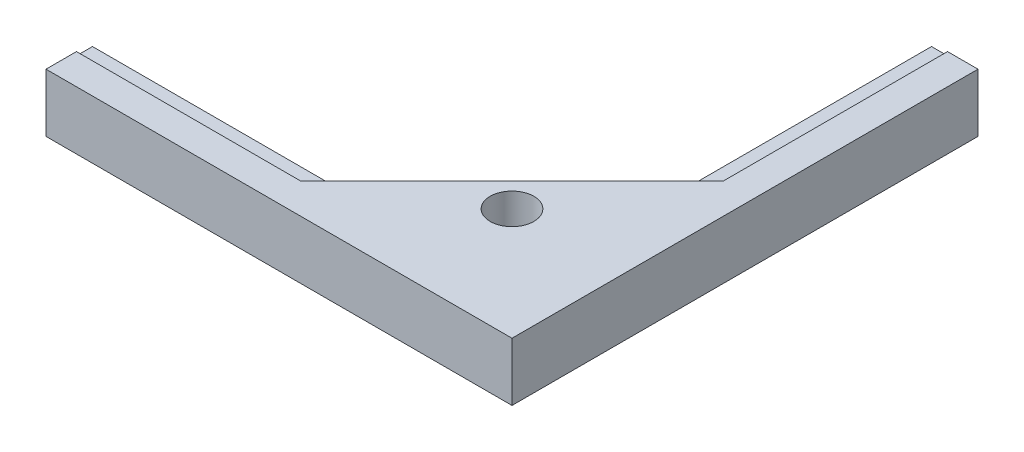
ISO-10303-21;
HEADER;
FILE_DESCRIPTION(('STEP AP214'),'2;1');
FILE_NAME('part.step','',(''),(''),'','','');
FILE_SCHEMA(('AUTOMOTIVE_DESIGN { 1 0 10303 214 1 1 1 1 }'));
ENDSEC;
DATA;
#1=APPLICATION_CONTEXT('core data for automotive mechanical design processes');
#2=APPLICATION_PROTOCOL_DEFINITION('international standard','automotive_design',2000,#1);
#3=PRODUCT_CONTEXT('',#1,'mechanical');
#4=PRODUCT('Part','Part','',(#3));
#5=PRODUCT_RELATED_PRODUCT_CATEGORY('part','',(#4));
#6=PRODUCT_DEFINITION_FORMATION('','',#4);
#7=PRODUCT_DEFINITION_CONTEXT('part definition',#1,'design');
#8=PRODUCT_DEFINITION('design','',#6,#7);
#9=PRODUCT_DEFINITION_SHAPE('','',#8);
#10=(LENGTH_UNIT() NAMED_UNIT(*) SI_UNIT(.MILLI.,.METRE.));
#11=(NAMED_UNIT(*) PLANE_ANGLE_UNIT() SI_UNIT($,.RADIAN.));
#12=(NAMED_UNIT(*) SI_UNIT($,.STERADIAN.) SOLID_ANGLE_UNIT());
#13=UNCERTAINTY_MEASURE_WITH_UNIT(LENGTH_MEASURE(1.E-05),#10,'distance_accuracy_value','');
#14=(GEOMETRIC_REPRESENTATION_CONTEXT(3) GLOBAL_UNCERTAINTY_ASSIGNED_CONTEXT((#13)) GLOBAL_UNIT_ASSIGNED_CONTEXT((#10,
#11,#12)) REPRESENTATION_CONTEXT('',''));
#15=CARTESIAN_POINT('',(0.,0.,0.));
#16=DIRECTION('',(0.,0.,1.));
#17=DIRECTION('',(1.,0.,0.));
#18=AXIS2_PLACEMENT_3D('',#15,#16,#17);
#19=CARTESIAN_POINT('',(-33.1850965905711,8.,-4.18509659057105));
#20=DIRECTION('',(0.,0.,1.));
#21=DIRECTION('',(1.,0.,0.));
#22=AXIS2_PLACEMENT_3D('',#19,#20,#21);
#23=PLANE('',#22);
#24=DIRECTION('',(-1.,0.,0.));
#25=VECTOR('',#24,1.);
#26=CARTESIAN_POINT('',(-33.1850965905711,7.5,-4.18509659057105));
#27=LINE('',#26,#25);
#28=CARTESIAN_POINT('',(-33.1850965905711,7.5,-4.18509659057105));
#29=VERTEX_POINT('',#28);
#30=CARTESIAN_POINT('',(-64.,7.5,-4.18509659057116));
#31=VERTEX_POINT('',#30);
#32=EDGE_CURVE('E149',#29,#31,#27,.T.);
#33=ORIENTED_EDGE('',*,*,#32,.T.);
#34=DIRECTION('',(0.,-1.,0.));
#35=VECTOR('',#34,1.);
#36=CARTESIAN_POINT('',(-64.,8.,-4.18509659057116));
#37=LINE('',#36,#35);
#38=CARTESIAN_POINT('',(-64.,8.,-4.18509659057116));
#39=VERTEX_POINT('',#38);
#40=EDGE_CURVE('E180',#39,#31,#37,.T.);
#41=ORIENTED_EDGE('',*,*,#40,.F.);
#42=DIRECTION('',(-1.,0.,0.));
#43=VECTOR('',#42,1.);
#44=CARTESIAN_POINT('',(-33.1850965905711,8.,-4.18509659057105));
#45=LINE('',#44,#43);
#46=CARTESIAN_POINT('',(-33.1850965905711,8.,-4.18509659057105));
#47=VERTEX_POINT('',#46);
#48=EDGE_CURVE('E174',#47,#39,#45,.T.);
#49=ORIENTED_EDGE('',*,*,#48,.F.);
#50=DIRECTION('',(0.,-1.,0.));
#51=VECTOR('',#50,1.);
#52=CARTESIAN_POINT('',(-33.1850965905711,8.,-4.18509659057105));
#53=LINE('',#52,#51);
#54=EDGE_CURVE('E167',#47,#29,#53,.T.);
#55=ORIENTED_EDGE('',*,*,#54,.T.);
#56=EDGE_LOOP('',(#33,#41,#49,#55));
#57=FACE_BOUND('',#56,.T.);
#58=ADVANCED_FACE('F41',(#57),#23,.F.);
#59=CARTESIAN_POINT('',(-4.18509659057107,8.,-64.));
#60=DIRECTION('',(1.,0.,0.));
#61=DIRECTION('',(0.,0.,-1.));
#62=AXIS2_PLACEMENT_3D('',#59,#60,#61);
#63=PLANE('',#62);
#64=DIRECTION('',(0.,0.,1.));
#65=VECTOR('',#64,1.);
#66=CARTESIAN_POINT('',(-4.18509659057107,7.5,-64.));
#67=LINE('',#66,#65);
#68=CARTESIAN_POINT('',(-4.18509659057107,7.5,-64.));
#69=VERTEX_POINT('',#68);
#70=CARTESIAN_POINT('',(-4.18509659057106,7.5,-33.1850965905712));
#71=VERTEX_POINT('',#70);
#72=EDGE_CURVE('E262',#69,#71,#67,.T.);
#73=ORIENTED_EDGE('',*,*,#72,.T.);
#74=DIRECTION('',(0.,-1.,0.));
#75=VECTOR('',#74,1.);
#76=CARTESIAN_POINT('',(-4.18509659057106,8.,-33.1850965905712));
#77=LINE('',#76,#75);
#78=CARTESIAN_POINT('',(-4.18509659057106,8.,-33.1850965905712));
#79=VERTEX_POINT('',#78);
#80=EDGE_CURVE('E178',#79,#71,#77,.T.);
#81=ORIENTED_EDGE('',*,*,#80,.F.);
#82=DIRECTION('',(0.,0.,1.));
#83=VECTOR('',#82,1.);
#84=CARTESIAN_POINT('',(-4.18509659057107,8.,-64.));
#85=LINE('',#84,#83);
#86=CARTESIAN_POINT('',(-4.18509659057107,8.,-64.));
#87=VERTEX_POINT('',#86);
#88=EDGE_CURVE('E252',#87,#79,#85,.T.);
#89=ORIENTED_EDGE('',*,*,#88,.F.);
#90=DIRECTION('',(0.,-1.,0.));
#91=VECTOR('',#90,1.);
#92=CARTESIAN_POINT('',(-4.18509659057107,8.,-64.));
#93=LINE('',#92,#91);
#94=EDGE_CURVE('E185',#87,#69,#93,.T.);
#95=ORIENTED_EDGE('',*,*,#94,.T.);
#96=EDGE_LOOP('',(#73,#81,#89,#95));
#97=FACE_BOUND('',#96,.T.);
#98=ADVANCED_FACE('F263',(#97),#63,.F.);
#99=CARTESIAN_POINT('',(0.,8.,0.));
#100=DIRECTION('',(0.,1.,0.));
#101=DIRECTION('',(0.,0.,1.));
#102=AXIS2_PLACEMENT_3D('',#99,#100,#101);
#103=PLANE('',#102);
#104=DIRECTION('',(1.,0.,0.));
#105=VECTOR('',#104,1.);
#106=CARTESIAN_POINT('',(-64.,8.,0.));
#107=LINE('',#106,#105);
#108=CARTESIAN_POINT('',(-64.,8.,0.));
#109=VERTEX_POINT('',#108);
#110=CARTESIAN_POINT('',(0.,8.,0.));
#111=VERTEX_POINT('',#110);
#112=EDGE_CURVE('E219',#109,#111,#107,.T.);
#113=ORIENTED_EDGE('',*,*,#112,.T.);
#114=DIRECTION('',(0.,0.,-1.));
#115=VECTOR('',#114,1.);
#116=CARTESIAN_POINT('',(0.,8.,0.));
#117=LINE('',#116,#115);
#118=CARTESIAN_POINT('',(0.,8.,-64.));
#119=VERTEX_POINT('',#118);
#120=EDGE_CURVE('E249',#111,#119,#117,.T.);
#121=ORIENTED_EDGE('',*,*,#120,.T.);
#122=DIRECTION('',(-1.,0.,0.));
#123=VECTOR('',#122,1.);
#124=CARTESIAN_POINT('',(0.,8.,-64.));
#125=LINE('',#124,#123);
#126=EDGE_CURVE('E196',#119,#87,#125,.T.);
#127=ORIENTED_EDGE('',*,*,#126,.T.);
#128=ORIENTED_EDGE('',*,*,#88,.T.);
#129=DIRECTION('',(-0.707106781186546,0.,0.707106781186549));
#130=VECTOR('',#129,1.);
#131=CARTESIAN_POINT('',(-4.18509659057106,8.,-33.1850965905712));
#132=LINE('',#131,#130);
#133=EDGE_CURVE('E232',#79,#47,#132,.T.);
#134=ORIENTED_EDGE('',*,*,#133,.T.);
#135=ORIENTED_EDGE('',*,*,#48,.T.);
#136=DIRECTION('',(0.,0.,1.));
#137=VECTOR('',#136,1.);
#138=CARTESIAN_POINT('',(-64.,8.,-4.18509659057116));
#139=LINE('',#138,#137);
#140=EDGE_CURVE('E223',#39,#109,#139,.T.);
#141=ORIENTED_EDGE('',*,*,#140,.T.);
#142=EDGE_LOOP('',(#113,#121,#127,#128,#134,#135,#141));
#143=FACE_BOUND('',#142,.T.);
#144=CARTESIAN_POINT('',(-15.3850965905711,8.,-15.3850965905711));
#145=DIRECTION('',(0.,1.,0.));
#146=DIRECTION('',(0.,0.,1.));
#147=AXIS2_PLACEMENT_3D('',#144,#145,#146);
#148=CIRCLE('',#147,3.);
#149=CARTESIAN_POINT('',(-15.3850965905711,8.,-12.3850965905711));
#150=VERTEX_POINT('',#149);
#151=EDGE_CURVE('E235',#150,#150,#148,.T.);
#152=ORIENTED_EDGE('',*,*,#151,.F.);
#153=EDGE_LOOP('',(#152));
#154=FACE_BOUND('',#153,.T.);
#155=ADVANCED_FACE('F253',(#143,#154),#103,.T.);
#156=CARTESIAN_POINT('',(0.,0.,0.));
#157=DIRECTION('',(0.,1.,0.));
#158=DIRECTION('',(0.,0.,1.));
#159=AXIS2_PLACEMENT_3D('',#156,#157,#158);
#160=PLANE('',#159);
#161=DIRECTION('',(1.,0.,0.));
#162=VECTOR('',#161,1.);
#163=CARTESIAN_POINT('',(-64.,0.,0.));
#164=LINE('',#163,#162);
#165=CARTESIAN_POINT('',(-64.,0.,0.));
#166=VERTEX_POINT('',#165);
#167=CARTESIAN_POINT('',(0.,0.,0.));
#168=VERTEX_POINT('',#167);
#169=EDGE_CURVE('E209',#166,#168,#164,.T.);
#170=ORIENTED_EDGE('',*,*,#169,.F.);
#171=DIRECTION('',(0.,0.,1.));
#172=VECTOR('',#171,1.);
#173=CARTESIAN_POINT('',(-64.,0.,-4.18509659057116));
#174=LINE('',#173,#172);
#175=CARTESIAN_POINT('',(-64.,0.,-4.18509659057116));
#176=VERTEX_POINT('',#175);
#177=EDGE_CURVE('E218',#176,#166,#174,.T.);
#178=ORIENTED_EDGE('',*,*,#177,.F.);
#179=DIRECTION('',(-1.,0.,0.));
#180=VECTOR('',#179,1.);
#181=CARTESIAN_POINT('',(-33.1850965905711,0.,-4.18509659057105));
#182=LINE('',#181,#180);
#183=CARTESIAN_POINT('',(-33.1850965905711,0.,-4.18509659057105));
#184=VERTEX_POINT('',#183);
#185=EDGE_CURVE('E215',#184,#176,#182,.T.);
#186=ORIENTED_EDGE('',*,*,#185,.F.);
#187=DIRECTION('',(-0.707106781186546,0.,0.707106781186549));
#188=VECTOR('',#187,1.);
#189=CARTESIAN_POINT('',(-4.18509659057106,0.,-33.1850965905712));
#190=LINE('',#189,#188);
#191=CARTESIAN_POINT('',(-4.18509659057106,0.,-33.1850965905712));
#192=VERTEX_POINT('',#191);
#193=EDGE_CURVE('E207',#192,#184,#190,.T.);
#194=ORIENTED_EDGE('',*,*,#193,.F.);
#195=DIRECTION('',(0.,0.,1.));
#196=VECTOR('',#195,1.);
#197=CARTESIAN_POINT('',(-4.18509659057107,0.,-64.));
#198=LINE('',#197,#196);
#199=CARTESIAN_POINT('',(-4.18509659057107,0.,-64.));
#200=VERTEX_POINT('',#199);
#201=EDGE_CURVE('E205',#200,#192,#198,.T.);
#202=ORIENTED_EDGE('',*,*,#201,.F.);
#203=DIRECTION('',(-1.,0.,0.));
#204=VECTOR('',#203,1.);
#205=CARTESIAN_POINT('',(0.,0.,-64.));
#206=LINE('',#205,#204);
#207=CARTESIAN_POINT('',(0.,0.,-64.));
#208=VERTEX_POINT('',#207);
#209=EDGE_CURVE('E193',#208,#200,#206,.T.);
#210=ORIENTED_EDGE('',*,*,#209,.F.);
#211=DIRECTION('',(0.,0.,-1.));
#212=VECTOR('',#211,1.);
#213=CARTESIAN_POINT('',(0.,0.,0.));
#214=LINE('',#213,#212);
#215=EDGE_CURVE('E202',#168,#208,#214,.T.);
#216=ORIENTED_EDGE('',*,*,#215,.F.);
#217=EDGE_LOOP('',(#170,#178,#186,#194,#202,#210,#216));
#218=FACE_BOUND('',#217,.T.);
#219=CARTESIAN_POINT('',(-15.3850965905711,0.,-15.3850965905711));
#220=DIRECTION('',(0.,1.,0.));
#221=DIRECTION('',(0.,0.,1.));
#222=AXIS2_PLACEMENT_3D('',#219,#220,#221);
#223=CIRCLE('',#222,3.);
#224=CARTESIAN_POINT('',(-15.3850965905711,0.,-12.3850965905711));
#225=VERTEX_POINT('',#224);
#226=EDGE_CURVE('E238',#225,#225,#223,.T.);
#227=ORIENTED_EDGE('',*,*,#226,.T.);
#228=EDGE_LOOP('',(#227));
#229=FACE_BOUND('',#228,.T.);
#230=ADVANCED_FACE('F200',(#218,#229),#160,.F.);
#231=CARTESIAN_POINT('',(-64.,8.,0.));
#232=DIRECTION('',(0.,0.,-1.));
#233=DIRECTION('',(-1.,0.,0.));
#234=AXIS2_PLACEMENT_3D('',#231,#232,#233);
#235=PLANE('',#234);
#236=ORIENTED_EDGE('',*,*,#169,.T.);
#237=DIRECTION('',(0.,-1.,0.));
#238=VECTOR('',#237,1.);
#239=CARTESIAN_POINT('',(0.,8.,0.));
#240=LINE('',#239,#238);
#241=EDGE_CURVE('E11',#111,#168,#240,.T.);
#242=ORIENTED_EDGE('',*,*,#241,.F.);
#243=ORIENTED_EDGE('',*,*,#112,.F.);
#244=DIRECTION('',(0.,-1.,0.));
#245=VECTOR('',#244,1.);
#246=CARTESIAN_POINT('',(-64.,8.,0.));
#247=LINE('',#246,#245);
#248=EDGE_CURVE('E220',#109,#166,#247,.T.);
#249=ORIENTED_EDGE('',*,*,#248,.T.);
#250=EDGE_LOOP('',(#236,#242,#243,#249));
#251=FACE_BOUND('',#250,.T.);
#252=ADVANCED_FACE('F43',(#251),#235,.F.);
#253=CARTESIAN_POINT('',(0.,8.,0.));
#254=DIRECTION('',(-1.,0.,0.));
#255=DIRECTION('',(0.,0.,1.));
#256=AXIS2_PLACEMENT_3D('',#253,#254,#255);
#257=PLANE('',#256);
#258=ORIENTED_EDGE('',*,*,#215,.T.);
#259=DIRECTION('',(0.,-1.,0.));
#260=VECTOR('',#259,1.);
#261=CARTESIAN_POINT('',(0.,8.,-64.));
#262=LINE('',#261,#260);
#263=EDGE_CURVE('E49',#119,#208,#262,.T.);
#264=ORIENTED_EDGE('',*,*,#263,.F.);
#265=ORIENTED_EDGE('',*,*,#120,.F.);
#266=ORIENTED_EDGE('',*,*,#241,.T.);
#267=EDGE_LOOP('',(#258,#264,#265,#266));
#268=FACE_BOUND('',#267,.T.);
#269=ADVANCED_FACE('F310',(#268),#257,.F.);
#270=CARTESIAN_POINT('',(0.,8.,-64.));
#271=DIRECTION('',(0.,0.,1.));
#272=DIRECTION('',(1.,0.,0.));
#273=AXIS2_PLACEMENT_3D('',#270,#271,#272);
#274=PLANE('',#273);
#275=ORIENTED_EDGE('',*,*,#209,.T.);
#276=CARTESIAN_POINT('',(-4.18509659057107,0.5,-64.));
#277=VERTEX_POINT('',#276);
#278=EDGE_CURVE('E184',#277,#200,#93,.T.);
#279=ORIENTED_EDGE('',*,*,#278,.F.);
#280=DIRECTION('',(1.,0.,0.));
#281=VECTOR('',#280,1.);
#282=CARTESIAN_POINT('',(-6.38509659057107,0.5,-64.));
#283=LINE('',#282,#281);
#284=CARTESIAN_POINT('',(-6.38509659057107,0.5,-64.));
#285=VERTEX_POINT('',#284);
#286=EDGE_CURVE('E282',#285,#277,#283,.T.);
#287=ORIENTED_EDGE('',*,*,#286,.F.);
#288=DIRECTION('',(0.,1.,0.));
#289=VECTOR('',#288,1.);
#290=CARTESIAN_POINT('',(-6.38509659057107,0.5,-64.));
#291=LINE('',#290,#289);
#292=CARTESIAN_POINT('',(-6.38509659057107,7.5,-64.));
#293=VERTEX_POINT('',#292);
#294=EDGE_CURVE('E278',#285,#293,#291,.T.);
#295=ORIENTED_EDGE('',*,*,#294,.T.);
#296=DIRECTION('',(1.,0.,0.));
#297=VECTOR('',#296,1.);
#298=CARTESIAN_POINT('',(-6.38509659057107,7.5,-64.));
#299=LINE('',#298,#297);
#300=EDGE_CURVE('E268',#293,#69,#299,.T.);
#301=ORIENTED_EDGE('',*,*,#300,.T.);
#302=ORIENTED_EDGE('',*,*,#94,.F.);
#303=ORIENTED_EDGE('',*,*,#126,.F.);
#304=ORIENTED_EDGE('',*,*,#263,.T.);
#305=EDGE_LOOP('',(#275,#279,#287,#295,#301,#302,#303,#304));
#306=FACE_BOUND('',#305,.T.);
#307=ADVANCED_FACE('F192',(#306),#274,.F.);
#308=CARTESIAN_POINT('',(-4.18509659057106,0.5,-33.1850965905712));
#309=VERTEX_POINT('',#308);
#310=EDGE_CURVE('E175',#309,#192,#77,.T.);
#311=ORIENTED_EDGE('',*,*,#310,.F.);
#312=DIRECTION('',(0.,0.,1.));
#313=VECTOR('',#312,1.);
#314=CARTESIAN_POINT('',(-4.18509659057107,0.5,-64.));
#315=LINE('',#314,#313);
#316=EDGE_CURVE('E64',#277,#309,#315,.T.);
#317=ORIENTED_EDGE('',*,*,#316,.F.);
#318=ORIENTED_EDGE('',*,*,#278,.T.);
#319=ORIENTED_EDGE('',*,*,#201,.T.);
#320=EDGE_LOOP('',(#311,#317,#318,#319));
#321=FACE_BOUND('',#320,.T.);
#322=ADVANCED_FACE('F317',(#321),#63,.F.);
#323=CARTESIAN_POINT('',(-4.18509659057106,8.,-33.1850965905712));
#324=DIRECTION('',(0.707106781186549,0.,0.707106781186546));
#325=DIRECTION('',(0.707106781186546,0.,-0.707106781186549));
#326=AXIS2_PLACEMENT_3D('',#323,#324,#325);
#327=PLANE('',#326);
#328=CARTESIAN_POINT('',(-33.1850965905711,0.5,-4.18509659057105));
#329=VERTEX_POINT('',#328);
#330=EDGE_CURVE('E176',#329,#184,#53,.T.);
#331=ORIENTED_EDGE('',*,*,#330,.F.);
#332=DIRECTION('',(-0.707106781186527,0.,0.707106781186567));
#333=VECTOR('',#332,1.);
#334=CARTESIAN_POINT('',(-30.9850965905711,0.5,-6.38509659057116));
#335=LINE('',#334,#333);
#336=CARTESIAN_POINT('',(-30.9850965905711,0.5,-6.38509659057116));
#337=VERTEX_POINT('',#336);
#338=EDGE_CURVE('E295',#337,#329,#335,.T.);
#339=ORIENTED_EDGE('',*,*,#338,.F.);
#340=DIRECTION('',(0.,1.,0.));
#341=VECTOR('',#340,1.);
#342=CARTESIAN_POINT('',(-30.9850965905711,0.5,-6.38509659057116));
#343=LINE('',#342,#341);
#344=CARTESIAN_POINT('',(-30.9850965905711,7.5,-6.38509659057116));
#345=VERTEX_POINT('',#344);
#346=EDGE_CURVE('E171',#337,#345,#343,.T.);
#347=ORIENTED_EDGE('',*,*,#346,.T.);
#348=DIRECTION('',(-0.707106781186527,0.,0.707106781186567));
#349=VECTOR('',#348,1.);
#350=CARTESIAN_POINT('',(-30.9850965905711,7.5,-6.38509659057116));
#351=LINE('',#350,#349);
#352=EDGE_CURVE('E153',#345,#29,#351,.T.);
#353=ORIENTED_EDGE('',*,*,#352,.T.);
#354=ORIENTED_EDGE('',*,*,#54,.F.);
#355=ORIENTED_EDGE('',*,*,#133,.F.);
#356=ORIENTED_EDGE('',*,*,#80,.T.);
#357=DIRECTION('',(-0.707106781186547,0.,0.707106781186548));
#358=VECTOR('',#357,1.);
#359=CARTESIAN_POINT('',(-4.18509659057106,7.5,-33.1850965905712));
#360=LINE('',#359,#358);
#361=CARTESIAN_POINT('',(-6.38509659057107,7.5,-30.9850965905712));
#362=VERTEX_POINT('',#361);
#363=EDGE_CURVE('E160',#71,#362,#360,.T.);
#364=ORIENTED_EDGE('',*,*,#363,.T.);
#365=DIRECTION('',(0.,1.,0.));
#366=VECTOR('',#365,1.);
#367=CARTESIAN_POINT('',(-6.38509659057107,0.5,-30.9850965905712));
#368=LINE('',#367,#366);
#369=CARTESIAN_POINT('',(-6.38509659057107,0.5,-30.9850965905712));
#370=VERTEX_POINT('',#369);
#371=EDGE_CURVE('E243',#370,#362,#368,.T.);
#372=ORIENTED_EDGE('',*,*,#371,.F.);
#373=DIRECTION('',(-0.707106781186547,0.,0.707106781186548));
#374=VECTOR('',#373,1.);
#375=CARTESIAN_POINT('',(-4.18509659057106,0.5,-33.1850965905712));
#376=LINE('',#375,#374);
#377=EDGE_CURVE('E267',#309,#370,#376,.T.);
#378=ORIENTED_EDGE('',*,*,#377,.F.);
#379=ORIENTED_EDGE('',*,*,#310,.T.);
#380=ORIENTED_EDGE('',*,*,#193,.T.);
#381=EDGE_LOOP('',(#331,#339,#347,#353,#354,#355,#356,#364,#372,#378,#379,#380));
#382=FACE_BOUND('',#381,.T.);
#383=ADVANCED_FACE('F165',(#382),#327,.F.);
#384=CARTESIAN_POINT('',(-64.,0.5,-4.18509659057116));
#385=VERTEX_POINT('',#384);
#386=EDGE_CURVE('E222',#385,#176,#37,.T.);
#387=ORIENTED_EDGE('',*,*,#386,.F.);
#388=DIRECTION('',(-1.,0.,0.));
#389=VECTOR('',#388,1.);
#390=CARTESIAN_POINT('',(-33.1850965905711,0.5,-4.18509659057105));
#391=LINE('',#390,#389);
#392=EDGE_CURVE('E56',#329,#385,#391,.T.);
#393=ORIENTED_EDGE('',*,*,#392,.F.);
#394=ORIENTED_EDGE('',*,*,#330,.T.);
#395=ORIENTED_EDGE('',*,*,#185,.T.);
#396=EDGE_LOOP('',(#387,#393,#394,#395));
#397=FACE_BOUND('',#396,.T.);
#398=ADVANCED_FACE('F321',(#397),#23,.F.);
#399=CARTESIAN_POINT('',(-64.,8.,-4.18509659057116));
#400=DIRECTION('',(1.,0.,0.));
#401=DIRECTION('',(0.,0.,-1.));
#402=AXIS2_PLACEMENT_3D('',#399,#400,#401);
#403=PLANE('',#402);
#404=ORIENTED_EDGE('',*,*,#177,.T.);
#405=ORIENTED_EDGE('',*,*,#248,.F.);
#406=ORIENTED_EDGE('',*,*,#140,.F.);
#407=ORIENTED_EDGE('',*,*,#40,.T.);
#408=DIRECTION('',(0.,0.,-1.));
#409=VECTOR('',#408,1.);
#410=CARTESIAN_POINT('',(-64.,7.5,-4.18509659057116));
#411=LINE('',#410,#409);
#412=CARTESIAN_POINT('',(-64.,7.5,-6.38509659057116));
#413=VERTEX_POINT('',#412);
#414=EDGE_CURVE('E155',#31,#413,#411,.T.);
#415=ORIENTED_EDGE('',*,*,#414,.T.);
#416=DIRECTION('',(0.,1.,0.));
#417=VECTOR('',#416,1.);
#418=CARTESIAN_POINT('',(-64.,0.5,-6.38509659057116));
#419=LINE('',#418,#417);
#420=CARTESIAN_POINT('',(-64.,0.5,-6.38509659057116));
#421=VERTEX_POINT('',#420);
#422=EDGE_CURVE('E300',#421,#413,#419,.T.);
#423=ORIENTED_EDGE('',*,*,#422,.F.);
#424=DIRECTION('',(0.,0.,-1.));
#425=VECTOR('',#424,1.);
#426=CARTESIAN_POINT('',(-64.,0.5,-4.18509659057116));
#427=LINE('',#426,#425);
#428=EDGE_CURVE('E291',#385,#421,#427,.T.);
#429=ORIENTED_EDGE('',*,*,#428,.F.);
#430=ORIENTED_EDGE('',*,*,#386,.T.);
#431=EDGE_LOOP('',(#404,#405,#406,#407,#415,#423,#429,#430));
#432=FACE_BOUND('',#431,.T.);
#433=ADVANCED_FACE('F307',(#432),#403,.F.);
#434=CARTESIAN_POINT('',(-15.3850965905711,8.,-15.3850965905711));
#435=DIRECTION('',(0.,-1.,0.));
#436=DIRECTION('',(0.,0.,-1.));
#437=AXIS2_PLACEMENT_3D('',#434,#435,#436);
#438=CYLINDRICAL_SURFACE('',#437,3.);
#439=ORIENTED_EDGE('',*,*,#151,.T.);
#440=EDGE_LOOP('',(#439));
#441=FACE_BOUND('',#440,.T.);
#442=ORIENTED_EDGE('',*,*,#226,.F.);
#443=EDGE_LOOP('',(#442));
#444=FACE_BOUND('',#443,.T.);
#445=ADVANCED_FACE('F334',(#441,#444),#438,.F.);
#446=CARTESIAN_POINT('',(-6.38509659057107,0.5,-30.9850965905712));
#447=DIRECTION('',(1.,0.,0.));
#448=DIRECTION('',(0.,0.,-1.));
#449=AXIS2_PLACEMENT_3D('',#446,#447,#448);
#450=PLANE('',#449);
#451=DIRECTION('',(0.,0.,-1.));
#452=VECTOR('',#451,1.);
#453=CARTESIAN_POINT('',(-6.38509659057107,7.5,-30.9850965905712));
#454=LINE('',#453,#452);
#455=EDGE_CURVE('E271',#362,#293,#454,.T.);
#456=ORIENTED_EDGE('',*,*,#455,.T.);
#457=ORIENTED_EDGE('',*,*,#294,.F.);
#458=DIRECTION('',(0.,0.,-1.));
#459=VECTOR('',#458,1.);
#460=CARTESIAN_POINT('',(-6.38509659057107,0.5,-30.9850965905712));
#461=LINE('',#460,#459);
#462=EDGE_CURVE('E286',#370,#285,#461,.T.);
#463=ORIENTED_EDGE('',*,*,#462,.F.);
#464=ORIENTED_EDGE('',*,*,#371,.T.);
#465=EDGE_LOOP('',(#456,#457,#463,#464));
#466=FACE_BOUND('',#465,.T.);
#467=ADVANCED_FACE('F369',(#466),#450,.F.);
#468=CARTESIAN_POINT('',(0.,0.5,0.));
#469=DIRECTION('',(0.,-1.,0.));
#470=DIRECTION('',(0.,0.,-1.));
#471=AXIS2_PLACEMENT_3D('',#468,#469,#470);
#472=PLANE('',#471);
#473=ORIENTED_EDGE('',*,*,#377,.T.);
#474=ORIENTED_EDGE('',*,*,#462,.T.);
#475=ORIENTED_EDGE('',*,*,#286,.T.);
#476=ORIENTED_EDGE('',*,*,#316,.T.);
#477=EDGE_LOOP('',(#473,#474,#475,#476));
#478=FACE_BOUND('',#477,.T.);
#479=ADVANCED_FACE('F417',(#478),#472,.T.);
#480=CARTESIAN_POINT('',(0.,7.5,0.));
#481=DIRECTION('',(0.,-1.,0.));
#482=DIRECTION('',(0.,0.,-1.));
#483=AXIS2_PLACEMENT_3D('',#480,#481,#482);
#484=PLANE('',#483);
#485=ORIENTED_EDGE('',*,*,#363,.F.);
#486=ORIENTED_EDGE('',*,*,#72,.F.);
#487=ORIENTED_EDGE('',*,*,#300,.F.);
#488=ORIENTED_EDGE('',*,*,#455,.F.);
#489=EDGE_LOOP('',(#485,#486,#487,#488));
#490=FACE_BOUND('',#489,.T.);
#491=ADVANCED_FACE('F270',(#490),#484,.F.);
#492=CARTESIAN_POINT('',(-64.,0.5,-6.38509659057116));
#493=DIRECTION('',(0.,0.,1.));
#494=DIRECTION('',(1.,0.,0.));
#495=AXIS2_PLACEMENT_3D('',#492,#493,#494);
#496=PLANE('',#495);
#497=DIRECTION('',(1.,0.,0.));
#498=VECTOR('',#497,1.);
#499=CARTESIAN_POINT('',(-64.,7.5,-6.38509659057116));
#500=LINE('',#499,#498);
#501=EDGE_CURVE('E172',#413,#345,#500,.T.);
#502=ORIENTED_EDGE('',*,*,#501,.T.);
#503=ORIENTED_EDGE('',*,*,#346,.F.);
#504=DIRECTION('',(1.,0.,0.));
#505=VECTOR('',#504,1.);
#506=CARTESIAN_POINT('',(-64.,0.5,-6.38509659057116));
#507=LINE('',#506,#505);
#508=EDGE_CURVE('E293',#421,#337,#507,.T.);
#509=ORIENTED_EDGE('',*,*,#508,.F.);
#510=ORIENTED_EDGE('',*,*,#422,.T.);
#511=EDGE_LOOP('',(#502,#503,#509,#510));
#512=FACE_BOUND('',#511,.T.);
#513=ADVANCED_FACE('F305',(#512),#496,.F.);
#514=CARTESIAN_POINT('',(0.,0.5,0.));
#515=DIRECTION('',(0.,-1.,0.));
#516=DIRECTION('',(0.,0.,-1.));
#517=AXIS2_PLACEMENT_3D('',#514,#515,#516);
#518=PLANE('',#517);
#519=ORIENTED_EDGE('',*,*,#392,.T.);
#520=ORIENTED_EDGE('',*,*,#428,.T.);
#521=ORIENTED_EDGE('',*,*,#508,.T.);
#522=ORIENTED_EDGE('',*,*,#338,.T.);
#523=EDGE_LOOP('',(#519,#520,#521,#522));
#524=FACE_BOUND('',#523,.T.);
#525=ADVANCED_FACE('F423',(#524),#518,.T.);
#526=CARTESIAN_POINT('',(0.,7.5,0.));
#527=DIRECTION('',(0.,-1.,0.));
#528=DIRECTION('',(0.,0.,-1.));
#529=AXIS2_PLACEMENT_3D('',#526,#527,#528);
#530=PLANE('',#529);
#531=ORIENTED_EDGE('',*,*,#32,.F.);
#532=ORIENTED_EDGE('',*,*,#352,.F.);
#533=ORIENTED_EDGE('',*,*,#501,.F.);
#534=ORIENTED_EDGE('',*,*,#414,.F.);
#535=EDGE_LOOP('',(#531,#532,#533,#534));
#536=FACE_BOUND('',#535,.T.);
#537=ADVANCED_FACE('F151',(#536),#530,.F.);
#538=CLOSED_SHELL('',(#58,#98,#155,#230,#252,#269,#307,#322,#383,#398,#433,#445,#467,#479,#491,
#513,#525,#537));
#539=MANIFOLD_SOLID_BREP('B2',#538);
#540=ADVANCED_BREP_SHAPE_REPRESENTATION('',(#18,#539),#14);
#541=SHAPE_DEFINITION_REPRESENTATION(#9,#540);
ENDSEC;
END-ISO-10303-21;
